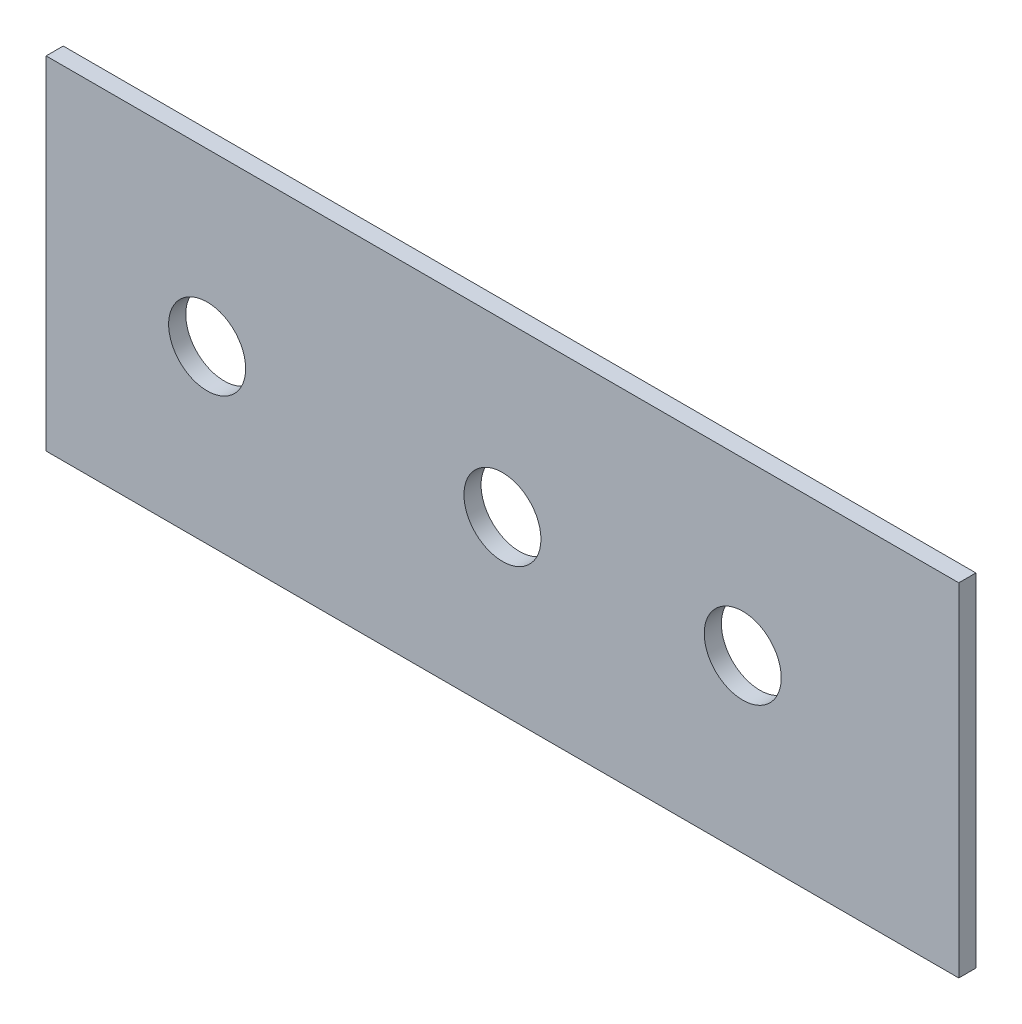
ISO-10303-21;
HEADER;
FILE_DESCRIPTION(('STEP AP214'),'2;1');
FILE_NAME('part.step','',(''),(''),'','','');
FILE_SCHEMA(('AUTOMOTIVE_DESIGN { 1 0 10303 214 1 1 1 1 }'));
ENDSEC;
DATA;
#1=APPLICATION_CONTEXT('core data for automotive mechanical design processes');
#2=APPLICATION_PROTOCOL_DEFINITION('international standard','automotive_design',2000,#1);
#3=PRODUCT_CONTEXT('',#1,'mechanical');
#4=PRODUCT('Part','Part','',(#3));
#5=PRODUCT_RELATED_PRODUCT_CATEGORY('part','',(#4));
#6=PRODUCT_DEFINITION_FORMATION('','',#4);
#7=PRODUCT_DEFINITION_CONTEXT('part definition',#1,'design');
#8=PRODUCT_DEFINITION('design','',#6,#7);
#9=PRODUCT_DEFINITION_SHAPE('','',#8);
#10=(LENGTH_UNIT() NAMED_UNIT(*) SI_UNIT(.MILLI.,.METRE.));
#11=(NAMED_UNIT(*) PLANE_ANGLE_UNIT() SI_UNIT($,.RADIAN.));
#12=(NAMED_UNIT(*) SI_UNIT($,.STERADIAN.) SOLID_ANGLE_UNIT());
#13=UNCERTAINTY_MEASURE_WITH_UNIT(LENGTH_MEASURE(1.E-05),#10,'distance_accuracy_value','');
#14=(GEOMETRIC_REPRESENTATION_CONTEXT(3) GLOBAL_UNCERTAINTY_ASSIGNED_CONTEXT((#13)) GLOBAL_UNIT_ASSIGNED_CONTEXT((#10,
#11,#12)) REPRESENTATION_CONTEXT('',''));
#15=CARTESIAN_POINT('',(0.,0.,0.));
#16=DIRECTION('',(0.,0.,1.));
#17=DIRECTION('',(1.,0.,0.));
#18=AXIS2_PLACEMENT_3D('',#15,#16,#17);
#19=CARTESIAN_POINT('',(160.,-60.,6.));
#20=DIRECTION('',(-1.,0.,0.));
#21=DIRECTION('',(0.,0.,1.));
#22=AXIS2_PLACEMENT_3D('',#19,#20,#21);
#23=PLANE('',#22);
#24=DIRECTION('',(0.,1.,0.));
#25=VECTOR('',#24,1.);
#26=CARTESIAN_POINT('',(160.,-60.,0.));
#27=LINE('',#26,#25);
#28=CARTESIAN_POINT('',(160.,-60.,0.));
#29=VERTEX_POINT('',#28);
#30=CARTESIAN_POINT('',(160.,60.,0.));
#31=VERTEX_POINT('',#30);
#32=EDGE_CURVE('E98',#29,#31,#27,.T.);
#33=ORIENTED_EDGE('',*,*,#32,.T.);
#34=DIRECTION('',(0.,0.,-1.));
#35=VECTOR('',#34,1.);
#36=CARTESIAN_POINT('',(160.,60.,6.));
#37=LINE('',#36,#35);
#38=CARTESIAN_POINT('',(160.,60.,6.));
#39=VERTEX_POINT('',#38);
#40=EDGE_CURVE('E11',#39,#31,#37,.T.);
#41=ORIENTED_EDGE('',*,*,#40,.F.);
#42=DIRECTION('',(0.,1.,0.));
#43=VECTOR('',#42,1.);
#44=CARTESIAN_POINT('',(160.,-60.,6.));
#45=LINE('',#44,#43);
#46=CARTESIAN_POINT('',(160.,-60.,6.));
#47=VERTEX_POINT('',#46);
#48=EDGE_CURVE('E86',#47,#39,#45,.T.);
#49=ORIENTED_EDGE('',*,*,#48,.F.);
#50=DIRECTION('',(0.,0.,-1.));
#51=VECTOR('',#50,1.);
#52=CARTESIAN_POINT('',(160.,-60.,6.));
#53=LINE('',#52,#51);
#54=EDGE_CURVE('E94',#47,#29,#53,.T.);
#55=ORIENTED_EDGE('',*,*,#54,.T.);
#56=EDGE_LOOP('',(#33,#41,#49,#55));
#57=FACE_BOUND('',#56,.T.);
#58=ADVANCED_FACE('F35',(#57),#23,.F.);
#59=CARTESIAN_POINT('',(-160.,60.,6.));
#60=DIRECTION('',(0.,-1.,0.));
#61=DIRECTION('',(0.,0.,-1.));
#62=AXIS2_PLACEMENT_3D('',#59,#60,#61);
#63=PLANE('',#62);
#64=DIRECTION('',(-1.,0.,0.));
#65=VECTOR('',#64,1.);
#66=CARTESIAN_POINT('',(-160.,60.,0.));
#67=LINE('',#66,#65);
#68=CARTESIAN_POINT('',(-160.,60.,0.));
#69=VERTEX_POINT('',#68);
#70=EDGE_CURVE('E90',#31,#69,#67,.T.);
#71=ORIENTED_EDGE('',*,*,#70,.T.);
#72=DIRECTION('',(0.,0.,-1.));
#73=VECTOR('',#72,1.);
#74=CARTESIAN_POINT('',(-160.,60.,6.));
#75=LINE('',#74,#73);
#76=CARTESIAN_POINT('',(-160.,60.,6.));
#77=VERTEX_POINT('',#76);
#78=EDGE_CURVE('E43',#77,#69,#75,.T.);
#79=ORIENTED_EDGE('',*,*,#78,.F.);
#80=DIRECTION('',(-1.,0.,0.));
#81=VECTOR('',#80,1.);
#82=CARTESIAN_POINT('',(-160.,60.,6.));
#83=LINE('',#82,#81);
#84=EDGE_CURVE('E81',#39,#77,#83,.T.);
#85=ORIENTED_EDGE('',*,*,#84,.F.);
#86=ORIENTED_EDGE('',*,*,#40,.T.);
#87=EDGE_LOOP('',(#71,#79,#85,#86));
#88=FACE_BOUND('',#87,.T.);
#89=ADVANCED_FACE('F89',(#88),#63,.F.);
#90=CARTESIAN_POINT('',(-160.,-60.,6.));
#91=DIRECTION('',(1.,0.,0.));
#92=DIRECTION('',(0.,0.,-1.));
#93=AXIS2_PLACEMENT_3D('',#90,#91,#92);
#94=PLANE('',#93);
#95=DIRECTION('',(0.,-1.,0.));
#96=VECTOR('',#95,1.);
#97=CARTESIAN_POINT('',(-160.,-60.,0.));
#98=LINE('',#97,#96);
#99=CARTESIAN_POINT('',(-160.,-60.,0.));
#100=VERTEX_POINT('',#99);
#101=EDGE_CURVE('E68',#69,#100,#98,.T.);
#102=ORIENTED_EDGE('',*,*,#101,.T.);
#103=DIRECTION('',(0.,0.,-1.));
#104=VECTOR('',#103,1.);
#105=CARTESIAN_POINT('',(-160.,-60.,6.));
#106=LINE('',#105,#104);
#107=CARTESIAN_POINT('',(-160.,-60.,6.));
#108=VERTEX_POINT('',#107);
#109=EDGE_CURVE('E91',#108,#100,#106,.T.);
#110=ORIENTED_EDGE('',*,*,#109,.F.);
#111=DIRECTION('',(0.,-1.,0.));
#112=VECTOR('',#111,1.);
#113=CARTESIAN_POINT('',(-160.,-60.,6.));
#114=LINE('',#113,#112);
#115=EDGE_CURVE('E84',#77,#108,#114,.T.);
#116=ORIENTED_EDGE('',*,*,#115,.F.);
#117=ORIENTED_EDGE('',*,*,#78,.T.);
#118=EDGE_LOOP('',(#102,#110,#116,#117));
#119=FACE_BOUND('',#118,.T.);
#120=ADVANCED_FACE('F92',(#119),#94,.F.);
#121=CARTESIAN_POINT('',(-160.,-60.,6.));
#122=DIRECTION('',(0.,1.,0.));
#123=DIRECTION('',(0.,0.,1.));
#124=AXIS2_PLACEMENT_3D('',#121,#122,#123);
#125=PLANE('',#124);
#126=DIRECTION('',(1.,0.,0.));
#127=VECTOR('',#126,1.);
#128=CARTESIAN_POINT('',(-160.,-60.,0.));
#129=LINE('',#128,#127);
#130=EDGE_CURVE('E74',#100,#29,#129,.T.);
#131=ORIENTED_EDGE('',*,*,#130,.T.);
#132=ORIENTED_EDGE('',*,*,#54,.F.);
#133=DIRECTION('',(1.,0.,0.));
#134=VECTOR('',#133,1.);
#135=CARTESIAN_POINT('',(-160.,-60.,6.));
#136=LINE('',#135,#134);
#137=EDGE_CURVE('E51',#108,#47,#136,.T.);
#138=ORIENTED_EDGE('',*,*,#137,.F.);
#139=ORIENTED_EDGE('',*,*,#109,.T.);
#140=EDGE_LOOP('',(#131,#132,#138,#139));
#141=FACE_BOUND('',#140,.T.);
#142=ADVANCED_FACE('F106',(#141),#125,.F.);
#143=CARTESIAN_POINT('',(0.,0.,6.));
#144=DIRECTION('',(0.,0.,-1.));
#145=DIRECTION('',(-1.,0.,0.));
#146=AXIS2_PLACEMENT_3D('',#143,#144,#145);
#147=PLANE('',#146);
#148=CARTESIAN_POINT('',(-103.538084119642,8.44475878115029E-11,6.));
#149=DIRECTION('',(0.,0.,1.));
#150=DIRECTION('',(1.,0.,0.));
#151=AXIS2_PLACEMENT_3D('',#148,#149,#150);
#152=CIRCLE('',#151,13.5);
#153=CARTESIAN_POINT('',(-90.0380841196423,8.44475878115029E-11,6.));
#154=VERTEX_POINT('',#153);
#155=EDGE_CURVE('E126',#154,#154,#152,.T.);
#156=ORIENTED_EDGE('',*,*,#155,.F.);
#157=EDGE_LOOP('',(#156));
#158=FACE_BOUND('',#157,.T.);
#159=CARTESIAN_POINT('',(-2.932029619096E-11,7.0684777475627E-11,6.));
#160=DIRECTION('',(0.,0.,1.));
#161=DIRECTION('',(1.,0.,0.));
#162=AXIS2_PLACEMENT_3D('',#159,#160,#161);
#163=CIRCLE('',#162,13.5);
#164=CARTESIAN_POINT('',(13.4999999999707,7.0684777475627E-11,6.));
#165=VERTEX_POINT('',#164);
#166=EDGE_CURVE('E120',#165,#165,#163,.T.);
#167=ORIENTED_EDGE('',*,*,#166,.F.);
#168=EDGE_LOOP('',(#167));
#169=FACE_BOUND('',#168,.T.);
#170=CARTESIAN_POINT('',(84.253962723635,5.95896632054242E-11,6.));
#171=DIRECTION('',(0.,0.,1.));
#172=DIRECTION('',(1.,0.,0.));
#173=AXIS2_PLACEMENT_3D('',#170,#171,#172);
#174=CIRCLE('',#173,13.5);
#175=CARTESIAN_POINT('',(97.753962723635,5.95896632054242E-11,6.));
#176=VERTEX_POINT('',#175);
#177=EDGE_CURVE('E114',#176,#176,#174,.T.);
#178=ORIENTED_EDGE('',*,*,#177,.F.);
#179=EDGE_LOOP('',(#178));
#180=FACE_BOUND('',#179,.T.);
#181=ORIENTED_EDGE('',*,*,#48,.T.);
#182=ORIENTED_EDGE('',*,*,#84,.T.);
#183=ORIENTED_EDGE('',*,*,#115,.T.);
#184=ORIENTED_EDGE('',*,*,#137,.T.);
#185=EDGE_LOOP('',(#181,#182,#183,#184));
#186=FACE_BOUND('',#185,.T.);
#187=ADVANCED_FACE('F82',(#158,#169,#180,#186),#147,.F.);
#188=CARTESIAN_POINT('',(0.,0.,0.));
#189=DIRECTION('',(0.,0.,-1.));
#190=DIRECTION('',(-1.,0.,0.));
#191=AXIS2_PLACEMENT_3D('',#188,#189,#190);
#192=PLANE('',#191);
#193=CARTESIAN_POINT('',(-103.538084119642,8.44475878115029E-11,0.));
#194=DIRECTION('',(0.,0.,1.));
#195=DIRECTION('',(1.,0.,0.));
#196=AXIS2_PLACEMENT_3D('',#193,#194,#195);
#197=CIRCLE('',#196,13.5);
#198=CARTESIAN_POINT('',(-90.0380841196423,8.44475878115029E-11,0.));
#199=VERTEX_POINT('',#198);
#200=EDGE_CURVE('E123',#199,#199,#197,.T.);
#201=ORIENTED_EDGE('',*,*,#200,.T.);
#202=EDGE_LOOP('',(#201));
#203=FACE_BOUND('',#202,.T.);
#204=CARTESIAN_POINT('',(-2.932029619096E-11,7.0684777475627E-11,0.));
#205=DIRECTION('',(0.,0.,1.));
#206=DIRECTION('',(1.,0.,0.));
#207=AXIS2_PLACEMENT_3D('',#204,#205,#206);
#208=CIRCLE('',#207,13.5);
#209=CARTESIAN_POINT('',(13.4999999999707,7.0684777475627E-11,0.));
#210=VERTEX_POINT('',#209);
#211=EDGE_CURVE('E117',#210,#210,#208,.T.);
#212=ORIENTED_EDGE('',*,*,#211,.T.);
#213=EDGE_LOOP('',(#212));
#214=FACE_BOUND('',#213,.T.);
#215=CARTESIAN_POINT('',(84.253962723635,5.95896632054242E-11,0.));
#216=DIRECTION('',(0.,0.,1.));
#217=DIRECTION('',(1.,0.,0.));
#218=AXIS2_PLACEMENT_3D('',#215,#216,#217);
#219=CIRCLE('',#218,13.5);
#220=CARTESIAN_POINT('',(97.753962723635,5.95896632054242E-11,0.));
#221=VERTEX_POINT('',#220);
#222=EDGE_CURVE('E101',#221,#221,#219,.T.);
#223=ORIENTED_EDGE('',*,*,#222,.T.);
#224=EDGE_LOOP('',(#223));
#225=FACE_BOUND('',#224,.T.);
#226=ORIENTED_EDGE('',*,*,#32,.F.);
#227=ORIENTED_EDGE('',*,*,#130,.F.);
#228=ORIENTED_EDGE('',*,*,#101,.F.);
#229=ORIENTED_EDGE('',*,*,#70,.F.);
#230=EDGE_LOOP('',(#226,#227,#228,#229));
#231=FACE_BOUND('',#230,.T.);
#232=ADVANCED_FACE('F109',(#203,#214,#225,#231),#192,.T.);
#233=CARTESIAN_POINT('',(84.253962723635,5.95896632054242E-11,6.));
#234=DIRECTION('',(0.,0.,1.));
#235=DIRECTION('',(1.,0.,0.));
#236=AXIS2_PLACEMENT_3D('',#233,#234,#235);
#237=CYLINDRICAL_SURFACE('',#236,13.5);
#238=ORIENTED_EDGE('',*,*,#222,.F.);
#239=EDGE_LOOP('',(#238));
#240=FACE_BOUND('',#239,.T.);
#241=ORIENTED_EDGE('',*,*,#177,.T.);
#242=EDGE_LOOP('',(#241));
#243=FACE_BOUND('',#242,.T.);
#244=ADVANCED_FACE('F139',(#240,#243),#237,.F.);
#245=CARTESIAN_POINT('',(-2.932029619096E-11,7.0684777475627E-11,6.));
#246=DIRECTION('',(0.,0.,1.));
#247=DIRECTION('',(1.,0.,0.));
#248=AXIS2_PLACEMENT_3D('',#245,#246,#247);
#249=CYLINDRICAL_SURFACE('',#248,13.5);
#250=ORIENTED_EDGE('',*,*,#211,.F.);
#251=EDGE_LOOP('',(#250));
#252=FACE_BOUND('',#251,.T.);
#253=ORIENTED_EDGE('',*,*,#166,.T.);
#254=EDGE_LOOP('',(#253));
#255=FACE_BOUND('',#254,.T.);
#256=ADVANCED_FACE('F141',(#252,#255),#249,.F.);
#257=CARTESIAN_POINT('',(-103.538084119642,8.44475878115029E-11,6.));
#258=DIRECTION('',(0.,0.,1.));
#259=DIRECTION('',(1.,0.,0.));
#260=AXIS2_PLACEMENT_3D('',#257,#258,#259);
#261=CYLINDRICAL_SURFACE('',#260,13.5);
#262=ORIENTED_EDGE('',*,*,#200,.F.);
#263=EDGE_LOOP('',(#262));
#264=FACE_BOUND('',#263,.T.);
#265=ORIENTED_EDGE('',*,*,#155,.T.);
#266=EDGE_LOOP('',(#265));
#267=FACE_BOUND('',#266,.T.);
#268=ADVANCED_FACE('F130',(#264,#267),#261,.F.);
#269=CLOSED_SHELL('',(#58,#89,#120,#142,#187,#232,#244,#256,#268));
#270=MANIFOLD_SOLID_BREP('B2',#269);
#271=ADVANCED_BREP_SHAPE_REPRESENTATION('',(#18,#270),#14);
#272=SHAPE_DEFINITION_REPRESENTATION(#9,#271);
ENDSEC;
END-ISO-10303-21;
